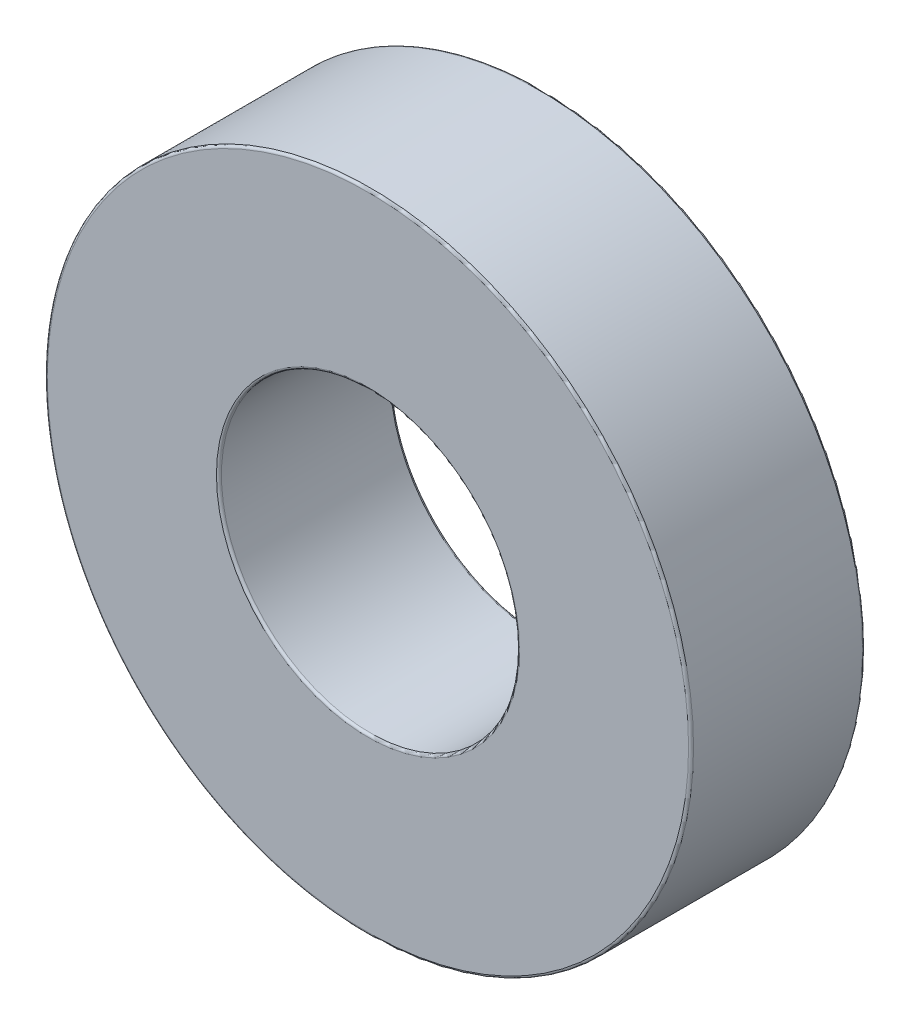
ISO-10303-21;
HEADER;
FILE_DESCRIPTION(('STEP AP214'),'2;1');
FILE_NAME('part.step','',(''),(''),'','','');
FILE_SCHEMA(('AUTOMOTIVE_DESIGN { 1 0 10303 214 1 1 1 1 }'));
ENDSEC;
DATA;
#1=APPLICATION_CONTEXT('core data for automotive mechanical design processes');
#2=APPLICATION_PROTOCOL_DEFINITION('international standard','automotive_design',2000,#1);
#3=PRODUCT_CONTEXT('',#1,'mechanical');
#4=PRODUCT('Part','Part','',(#3));
#5=PRODUCT_RELATED_PRODUCT_CATEGORY('part','',(#4));
#6=PRODUCT_DEFINITION_FORMATION('','',#4);
#7=PRODUCT_DEFINITION_CONTEXT('part definition',#1,'design');
#8=PRODUCT_DEFINITION('design','',#6,#7);
#9=PRODUCT_DEFINITION_SHAPE('','',#8);
#10=(LENGTH_UNIT() NAMED_UNIT(*) SI_UNIT(.MILLI.,.METRE.));
#11=(NAMED_UNIT(*) PLANE_ANGLE_UNIT() SI_UNIT($,.RADIAN.));
#12=(NAMED_UNIT(*) SI_UNIT($,.STERADIAN.) SOLID_ANGLE_UNIT());
#13=UNCERTAINTY_MEASURE_WITH_UNIT(LENGTH_MEASURE(1.E-05),#10,'distance_accuracy_value','');
#14=(GEOMETRIC_REPRESENTATION_CONTEXT(3) GLOBAL_UNCERTAINTY_ASSIGNED_CONTEXT((#13)) GLOBAL_UNIT_ASSIGNED_CONTEXT((#10,
#11,#12)) REPRESENTATION_CONTEXT('',''));
#15=CARTESIAN_POINT('',(0.,0.,0.));
#16=DIRECTION('',(0.,0.,1.));
#17=DIRECTION('',(1.,0.,0.));
#18=AXIS2_PLACEMENT_3D('',#15,#16,#17);
#19=CARTESIAN_POINT('',(0.,0.,3.5));
#20=DIRECTION('',(0.,0.,1.));
#21=DIRECTION('',(1.,0.,0.));
#22=AXIS2_PLACEMENT_3D('',#19,#20,#21);
#23=PLANE('',#22);
#24=CARTESIAN_POINT('',(0.,0.,3.5));
#25=DIRECTION('',(0.,0.,1.));
#26=DIRECTION('',(1.,0.,0.));
#27=AXIS2_PLACEMENT_3D('',#24,#25,#26);
#28=CIRCLE('',#27,3.05);
#29=CARTESIAN_POINT('',(3.05,0.,3.5));
#30=VERTEX_POINT('',#29);
#31=EDGE_CURVE('E10',#30,#30,#28,.F.);
#32=ORIENTED_EDGE('',*,*,#31,.T.);
#33=EDGE_LOOP('',(#32));
#34=FACE_BOUND('',#33,.T.);
#35=CARTESIAN_POINT('',(0.,0.,3.5));
#36=DIRECTION('',(0.,0.,1.));
#37=DIRECTION('',(1.,0.,0.));
#38=AXIS2_PLACEMENT_3D('',#35,#36,#37);
#39=CIRCLE('',#38,6.45);
#40=CARTESIAN_POINT('',(6.45,0.,3.5));
#41=VERTEX_POINT('',#40);
#42=EDGE_CURVE('E38',#41,#41,#39,.T.);
#43=ORIENTED_EDGE('',*,*,#42,.T.);
#44=EDGE_LOOP('',(#43));
#45=FACE_BOUND('',#44,.T.);
#46=ADVANCED_FACE('F31',(#34,#45),#23,.T.);
#47=CARTESIAN_POINT('',(0.,0.,0.));
#48=DIRECTION('',(0.,0.,1.));
#49=DIRECTION('',(1.,0.,0.));
#50=AXIS2_PLACEMENT_3D('',#47,#48,#49);
#51=PLANE('',#50);
#52=CARTESIAN_POINT('',(0.,0.,0.));
#53=DIRECTION('',(0.,0.,1.));
#54=DIRECTION('',(1.,0.,0.));
#55=AXIS2_PLACEMENT_3D('',#52,#53,#54);
#56=CIRCLE('',#55,6.45);
#57=CARTESIAN_POINT('',(6.45,0.,0.));
#58=VERTEX_POINT('',#57);
#59=EDGE_CURVE('E51',#58,#58,#56,.F.);
#60=ORIENTED_EDGE('',*,*,#59,.T.);
#61=EDGE_LOOP('',(#60));
#62=FACE_BOUND('',#61,.T.);
#63=CARTESIAN_POINT('',(0.,0.,0.));
#64=DIRECTION('',(0.,0.,1.));
#65=DIRECTION('',(1.,0.,0.));
#66=AXIS2_PLACEMENT_3D('',#63,#64,#65);
#67=CIRCLE('',#66,3.05);
#68=CARTESIAN_POINT('',(3.05,0.,0.));
#69=VERTEX_POINT('',#68);
#70=EDGE_CURVE('E54',#69,#69,#67,.T.);
#71=ORIENTED_EDGE('',*,*,#70,.T.);
#72=EDGE_LOOP('',(#71));
#73=FACE_BOUND('',#72,.T.);
#74=ADVANCED_FACE('F75',(#62,#73),#51,.F.);
#75=CARTESIAN_POINT('',(0.,0.,3.5));
#76=DIRECTION('',(0.,0.,-1.));
#77=DIRECTION('',(-1.,0.,0.));
#78=AXIS2_PLACEMENT_3D('',#75,#76,#77);
#79=CYLINDRICAL_SURFACE('',#78,6.5);
#80=CARTESIAN_POINT('',(0.,0.,0.0500000000000001));
#81=DIRECTION('',(0.,0.,1.));
#82=DIRECTION('',(1.,0.,0.));
#83=AXIS2_PLACEMENT_3D('',#80,#81,#82);
#84=CIRCLE('',#83,6.5);
#85=CARTESIAN_POINT('',(6.5,0.,0.0500000000000001));
#86=VERTEX_POINT('',#85);
#87=EDGE_CURVE('E57',#86,#86,#84,.T.);
#88=ORIENTED_EDGE('',*,*,#87,.T.);
#89=EDGE_LOOP('',(#88));
#90=FACE_BOUND('',#89,.T.);
#91=CARTESIAN_POINT('',(0.,0.,3.45));
#92=DIRECTION('',(0.,0.,1.));
#93=DIRECTION('',(1.,0.,0.));
#94=AXIS2_PLACEMENT_3D('',#91,#92,#93);
#95=CIRCLE('',#94,6.5);
#96=CARTESIAN_POINT('',(6.5,0.,3.45));
#97=VERTEX_POINT('',#96);
#98=EDGE_CURVE('E60',#97,#97,#95,.F.);
#99=ORIENTED_EDGE('',*,*,#98,.T.);
#100=EDGE_LOOP('',(#99));
#101=FACE_BOUND('',#100,.T.);
#102=ADVANCED_FACE('F64',(#90,#101),#79,.T.);
#103=CARTESIAN_POINT('',(0.,0.,3.5));
#104=DIRECTION('',(0.,0.,-1.));
#105=DIRECTION('',(-1.,0.,0.));
#106=AXIS2_PLACEMENT_3D('',#103,#104,#105);
#107=CYLINDRICAL_SURFACE('',#106,3.);
#108=CARTESIAN_POINT('',(0.,0.,0.0500000000000001));
#109=DIRECTION('',(0.,0.,1.));
#110=DIRECTION('',(1.,0.,0.));
#111=AXIS2_PLACEMENT_3D('',#108,#109,#110);
#112=CIRCLE('',#111,3.);
#113=CARTESIAN_POINT('',(3.,0.,0.0500000000000001));
#114=VERTEX_POINT('',#113);
#115=EDGE_CURVE('E42',#114,#114,#112,.F.);
#116=ORIENTED_EDGE('',*,*,#115,.T.);
#117=EDGE_LOOP('',(#116));
#118=FACE_BOUND('',#117,.T.);
#119=CARTESIAN_POINT('',(0.,0.,3.45));
#120=DIRECTION('',(0.,0.,1.));
#121=DIRECTION('',(1.,0.,0.));
#122=AXIS2_PLACEMENT_3D('',#119,#120,#121);
#123=CIRCLE('',#122,3.);
#124=CARTESIAN_POINT('',(3.,0.,3.45));
#125=VERTEX_POINT('',#124);
#126=EDGE_CURVE('E46',#125,#125,#123,.T.);
#127=ORIENTED_EDGE('',*,*,#126,.T.);
#128=EDGE_LOOP('',(#127));
#129=FACE_BOUND('',#128,.T.);
#130=ADVANCED_FACE('F83',(#118,#129),#107,.F.);
#131=CARTESIAN_POINT('',(0.,0.,0.0500000000000001));
#132=DIRECTION('',(0.,0.,1.));
#133=DIRECTION('',(1.,0.,0.));
#134=AXIS2_PLACEMENT_3D('',#131,#132,#133);
#135=TOROIDAL_SURFACE('',#134,6.45,0.05);
#136=ORIENTED_EDGE('',*,*,#59,.F.);
#137=EDGE_LOOP('',(#136));
#138=FACE_BOUND('',#137,.T.);
#139=ORIENTED_EDGE('',*,*,#87,.F.);
#140=EDGE_LOOP('',(#139));
#141=FACE_BOUND('',#140,.T.);
#142=ADVANCED_FACE('F88',(#138,#141),#135,.T.);
#143=CARTESIAN_POINT('',(0.,0.,0.0500000000000001));
#144=DIRECTION('',(0.,0.,1.));
#145=DIRECTION('',(1.,0.,0.));
#146=AXIS2_PLACEMENT_3D('',#143,#144,#145);
#147=TOROIDAL_SURFACE('',#146,3.05,0.05);
#148=ORIENTED_EDGE('',*,*,#115,.F.);
#149=EDGE_LOOP('',(#148));
#150=FACE_BOUND('',#149,.T.);
#151=ORIENTED_EDGE('',*,*,#70,.F.);
#152=EDGE_LOOP('',(#151));
#153=FACE_BOUND('',#152,.T.);
#154=ADVANCED_FACE('F72',(#150,#153),#147,.T.);
#155=CARTESIAN_POINT('',(0.,0.,3.45));
#156=DIRECTION('',(0.,0.,1.));
#157=DIRECTION('',(1.,0.,0.));
#158=AXIS2_PLACEMENT_3D('',#155,#156,#157);
#159=TOROIDAL_SURFACE('',#158,3.05,0.05);
#160=ORIENTED_EDGE('',*,*,#31,.F.);
#161=EDGE_LOOP('',(#160));
#162=FACE_BOUND('',#161,.T.);
#163=ORIENTED_EDGE('',*,*,#126,.F.);
#164=EDGE_LOOP('',(#163));
#165=FACE_BOUND('',#164,.T.);
#166=ADVANCED_FACE('F68',(#162,#165),#159,.T.);
#167=CARTESIAN_POINT('',(0.,0.,3.45));
#168=DIRECTION('',(0.,0.,1.));
#169=DIRECTION('',(1.,0.,0.));
#170=AXIS2_PLACEMENT_3D('',#167,#168,#169);
#171=TOROIDAL_SURFACE('',#170,6.45,0.05);
#172=ORIENTED_EDGE('',*,*,#98,.F.);
#173=EDGE_LOOP('',(#172));
#174=FACE_BOUND('',#173,.T.);
#175=ORIENTED_EDGE('',*,*,#42,.F.);
#176=EDGE_LOOP('',(#175));
#177=FACE_BOUND('',#176,.T.);
#178=ADVANCED_FACE('F33',(#174,#177),#171,.T.);
#179=CLOSED_SHELL('',(#46,#74,#102,#130,#142,#154,#166,#178));
#180=MANIFOLD_SOLID_BREP('B2',#179);
#181=ADVANCED_BREP_SHAPE_REPRESENTATION('',(#18,#180),#14);
#182=SHAPE_DEFINITION_REPRESENTATION(#9,#181);
ENDSEC;
END-ISO-10303-21;
